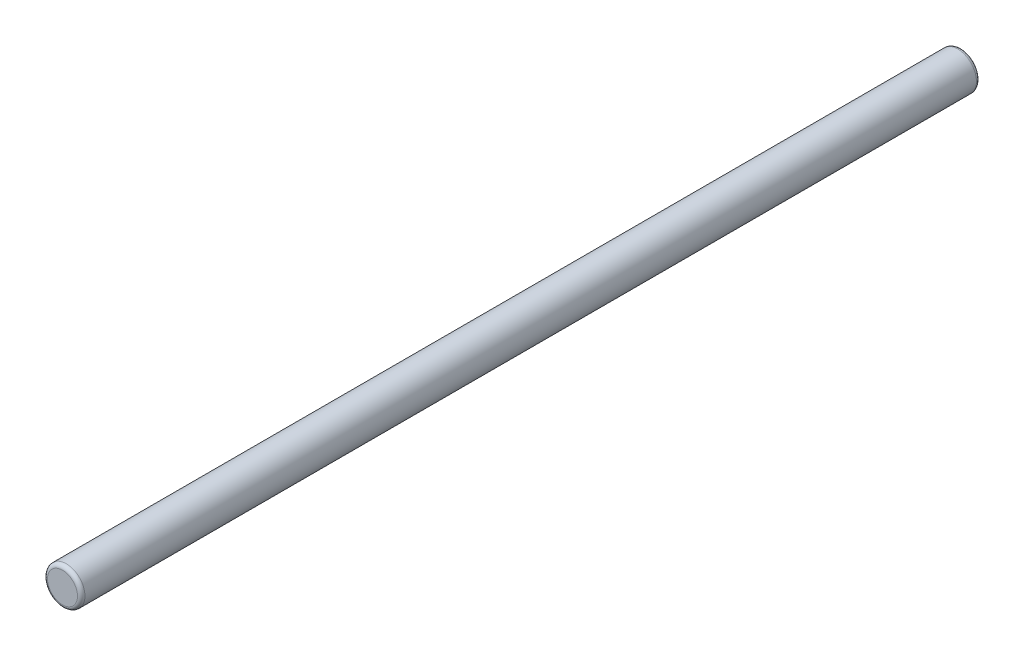
ISO-10303-21;
HEADER;
FILE_DESCRIPTION(('STEP AP214'),'2;1');
FILE_NAME('part.step','',(''),(''),'','','');
FILE_SCHEMA(('AUTOMOTIVE_DESIGN { 1 0 10303 214 1 1 1 1 }'));
ENDSEC;
DATA;
#1=APPLICATION_CONTEXT('core data for automotive mechanical design processes');
#2=APPLICATION_PROTOCOL_DEFINITION('international standard','automotive_design',2000,#1);
#3=PRODUCT_CONTEXT('',#1,'mechanical');
#4=PRODUCT('Part','Part','',(#3));
#5=PRODUCT_RELATED_PRODUCT_CATEGORY('part','',(#4));
#6=PRODUCT_DEFINITION_FORMATION('','',#4);
#7=PRODUCT_DEFINITION_CONTEXT('part definition',#1,'design');
#8=PRODUCT_DEFINITION('design','',#6,#7);
#9=PRODUCT_DEFINITION_SHAPE('','',#8);
#10=(LENGTH_UNIT() NAMED_UNIT(*) SI_UNIT(.MILLI.,.METRE.));
#11=(NAMED_UNIT(*) PLANE_ANGLE_UNIT() SI_UNIT($,.RADIAN.));
#12=(NAMED_UNIT(*) SI_UNIT($,.STERADIAN.) SOLID_ANGLE_UNIT());
#13=UNCERTAINTY_MEASURE_WITH_UNIT(LENGTH_MEASURE(1.E-05),#10,'distance_accuracy_value','');
#14=(GEOMETRIC_REPRESENTATION_CONTEXT(3) GLOBAL_UNCERTAINTY_ASSIGNED_CONTEXT((#13)) GLOBAL_UNIT_ASSIGNED_CONTEXT((#10,
#11,#12)) REPRESENTATION_CONTEXT('',''));
#15=CARTESIAN_POINT('',(0.,0.,0.));
#16=DIRECTION('',(0.,0.,1.));
#17=DIRECTION('',(1.,0.,0.));
#18=AXIS2_PLACEMENT_3D('',#15,#16,#17);
#19=CARTESIAN_POINT('',(0.,0.,120.));
#20=DIRECTION('',(0.,0.,-1.));
#21=DIRECTION('',(-1.,0.,0.));
#22=AXIS2_PLACEMENT_3D('',#19,#20,#21);
#23=CYLINDRICAL_SURFACE('',#22,2.5);
#24=CARTESIAN_POINT('',(0.,0.,119.5));
#25=DIRECTION('',(0.,0.,1.));
#26=DIRECTION('',(1.,0.,0.));
#27=AXIS2_PLACEMENT_3D('',#24,#25,#26);
#28=CIRCLE('',#27,2.5);
#29=CARTESIAN_POINT('',(2.5,0.,119.5));
#30=VERTEX_POINT('',#29);
#31=EDGE_CURVE('E45',#30,#30,#28,.F.);
#32=ORIENTED_EDGE('',*,*,#31,.T.);
#33=EDGE_LOOP('',(#32));
#34=FACE_BOUND('',#33,.T.);
#35=CARTESIAN_POINT('',(0.,0.,0.5));
#36=DIRECTION('',(0.,0.,1.));
#37=DIRECTION('',(1.,0.,0.));
#38=AXIS2_PLACEMENT_3D('',#35,#36,#37);
#39=CIRCLE('',#38,2.5);
#40=CARTESIAN_POINT('',(2.5,0.,0.5));
#41=VERTEX_POINT('',#40);
#42=EDGE_CURVE('E50',#41,#41,#39,.T.);
#43=ORIENTED_EDGE('',*,*,#42,.T.);
#44=EDGE_LOOP('',(#43));
#45=FACE_BOUND('',#44,.T.);
#46=ADVANCED_FACE('F37',(#34,#45),#23,.T.);
#47=CARTESIAN_POINT('',(0.,0.,120.));
#48=DIRECTION('',(0.,0.,1.));
#49=DIRECTION('',(1.,0.,0.));
#50=AXIS2_PLACEMENT_3D('',#47,#48,#49);
#51=PLANE('',#50);
#52=CARTESIAN_POINT('',(0.,0.,120.));
#53=DIRECTION('',(0.,0.,1.));
#54=DIRECTION('',(1.,0.,0.));
#55=AXIS2_PLACEMENT_3D('',#52,#53,#54);
#56=CIRCLE('',#55,2.);
#57=CARTESIAN_POINT('',(2.,0.,120.));
#58=VERTEX_POINT('',#57);
#59=EDGE_CURVE('E55',#58,#58,#56,.T.);
#60=ORIENTED_EDGE('',*,*,#59,.T.);
#61=EDGE_LOOP('',(#60));
#62=FACE_BOUND('',#61,.T.);
#63=ADVANCED_FACE('F62',(#62),#51,.T.);
#64=CARTESIAN_POINT('',(0.,0.,0.));
#65=DIRECTION('',(0.,0.,1.));
#66=DIRECTION('',(1.,0.,0.));
#67=AXIS2_PLACEMENT_3D('',#64,#65,#66);
#68=PLANE('',#67);
#69=CARTESIAN_POINT('',(0.,0.,0.));
#70=DIRECTION('',(0.,0.,1.));
#71=DIRECTION('',(1.,0.,0.));
#72=AXIS2_PLACEMENT_3D('',#69,#70,#71);
#73=CIRCLE('',#72,2.);
#74=CARTESIAN_POINT('',(2.,0.,0.));
#75=VERTEX_POINT('',#74);
#76=EDGE_CURVE('E10',#75,#75,#73,.F.);
#77=ORIENTED_EDGE('',*,*,#76,.T.);
#78=EDGE_LOOP('',(#77));
#79=FACE_BOUND('',#78,.T.);
#80=ADVANCED_FACE('F66',(#79),#68,.F.);
#81=CARTESIAN_POINT('',(0.,0.,119.5));
#82=DIRECTION('',(0.,0.,1.));
#83=DIRECTION('',(1.,0.,0.));
#84=AXIS2_PLACEMENT_3D('',#81,#82,#83);
#85=TOROIDAL_SURFACE('',#84,2.,0.5);
#86=ORIENTED_EDGE('',*,*,#31,.F.);
#87=EDGE_LOOP('',(#86));
#88=FACE_BOUND('',#87,.T.);
#89=ORIENTED_EDGE('',*,*,#59,.F.);
#90=EDGE_LOOP('',(#89));
#91=FACE_BOUND('',#90,.T.);
#92=ADVANCED_FACE('F64',(#88,#91),#85,.T.);
#93=CARTESIAN_POINT('',(0.,0.,0.5));
#94=DIRECTION('',(0.,0.,1.));
#95=DIRECTION('',(1.,0.,0.));
#96=AXIS2_PLACEMENT_3D('',#93,#94,#95);
#97=TOROIDAL_SURFACE('',#96,2.,0.5);
#98=ORIENTED_EDGE('',*,*,#76,.F.);
#99=EDGE_LOOP('',(#98));
#100=FACE_BOUND('',#99,.T.);
#101=ORIENTED_EDGE('',*,*,#42,.F.);
#102=EDGE_LOOP('',(#101));
#103=FACE_BOUND('',#102,.T.);
#104=ADVANCED_FACE('F39',(#100,#103),#97,.T.);
#105=CLOSED_SHELL('',(#46,#63,#80,#92,#104));
#106=MANIFOLD_SOLID_BREP('B2',#105);
#107=ADVANCED_BREP_SHAPE_REPRESENTATION('',(#18,#106),#14);
#108=SHAPE_DEFINITION_REPRESENTATION(#9,#107);
ENDSEC;
END-ISO-10303-21;
